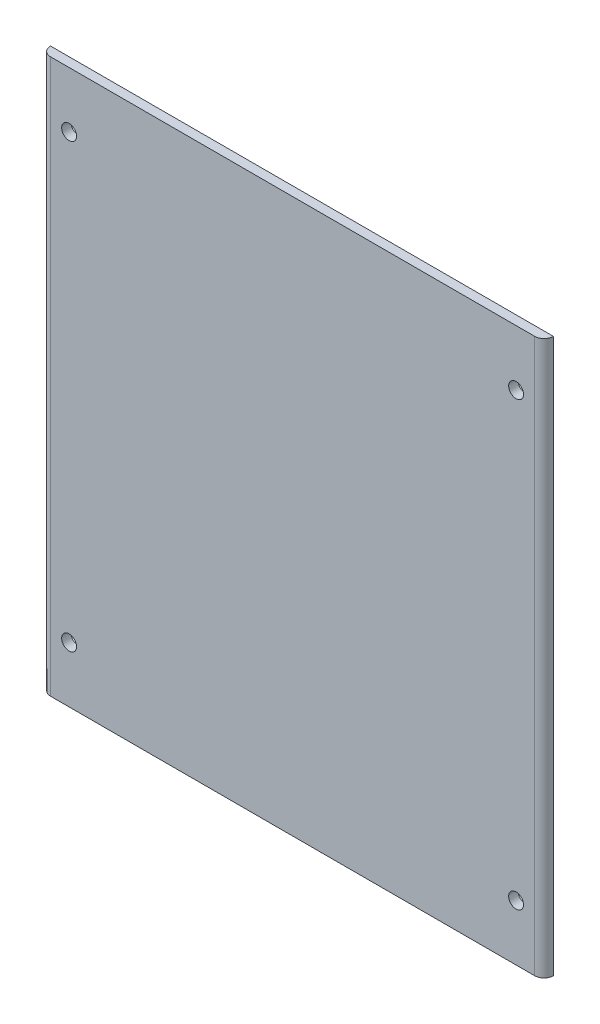
ISO-10303-21;
HEADER;
FILE_DESCRIPTION(('STEP AP214'),'2;1');
FILE_NAME('part.step','',(''),(''),'','','');
FILE_SCHEMA(('AUTOMOTIVE_DESIGN { 1 0 10303 214 1 1 1 1 }'));
ENDSEC;
DATA;
#1=APPLICATION_CONTEXT('core data for automotive mechanical design processes');
#2=APPLICATION_PROTOCOL_DEFINITION('international standard','automotive_design',2000,#1);
#3=PRODUCT_CONTEXT('',#1,'mechanical');
#4=PRODUCT('Part','Part','',(#3));
#5=PRODUCT_RELATED_PRODUCT_CATEGORY('part','',(#4));
#6=PRODUCT_DEFINITION_FORMATION('','',#4);
#7=PRODUCT_DEFINITION_CONTEXT('part definition',#1,'design');
#8=PRODUCT_DEFINITION('design','',#6,#7);
#9=PRODUCT_DEFINITION_SHAPE('','',#8);
#10=(LENGTH_UNIT() NAMED_UNIT(*) SI_UNIT(.MILLI.,.METRE.));
#11=(NAMED_UNIT(*) PLANE_ANGLE_UNIT() SI_UNIT($,.RADIAN.));
#12=(NAMED_UNIT(*) SI_UNIT($,.STERADIAN.) SOLID_ANGLE_UNIT());
#13=UNCERTAINTY_MEASURE_WITH_UNIT(LENGTH_MEASURE(1.E-05),#10,'distance_accuracy_value','');
#14=(GEOMETRIC_REPRESENTATION_CONTEXT(3) GLOBAL_UNCERTAINTY_ASSIGNED_CONTEXT((#13)) GLOBAL_UNIT_ASSIGNED_CONTEXT((#10,
#11,#12)) REPRESENTATION_CONTEXT('',''));
#15=CARTESIAN_POINT('',(0.,0.,0.));
#16=DIRECTION('',(0.,0.,1.));
#17=DIRECTION('',(1.,0.,0.));
#18=AXIS2_PLACEMENT_3D('',#15,#16,#17);
#19=CARTESIAN_POINT('',(-4.00000000000001,118.94,2.));
#20=DIRECTION('',(0.,-1.,0.));
#21=DIRECTION('',(1.,0.,0.));
#22=AXIS2_PLACEMENT_3D('',#19,#20,#21);
#23=PLANE('',#22);
#24=DIRECTION('',(-1.,0.,0.));
#25=VECTOR('',#24,1.);
#26=CARTESIAN_POINT('',(-4.00000000000001,118.94,2.));
#27=LINE('',#26,#25);
#28=CARTESIAN_POINT('',(-3.99999999999936,118.94,2.));
#29=VERTEX_POINT('',#28);
#30=CARTESIAN_POINT('',(-108.,118.94,2.));
#31=VERTEX_POINT('',#30);
#32=EDGE_CURVE('E130',#29,#31,#27,.T.);
#33=ORIENTED_EDGE('',*,*,#32,.F.);
#34=CARTESIAN_POINT('',(-3.99999999999936,118.94,0.));
#35=DIRECTION('',(0.,-1.,0.));
#36=DIRECTION('',(1.,0.,0.));
#37=AXIS2_PLACEMENT_3D('',#34,#35,#36);
#38=CIRCLE('',#37,2.);
#39=CARTESIAN_POINT('',(-1.99999999999936,118.940000000001,0.));
#40=VERTEX_POINT('',#39);
#41=EDGE_CURVE('E12',#29,#40,#38,.F.);
#42=ORIENTED_EDGE('',*,*,#41,.T.);
#43=DIRECTION('',(-1.,0.,0.));
#44=VECTOR('',#43,1.);
#45=CARTESIAN_POINT('',(-4.00000000000001,118.94,0.));
#46=LINE('',#45,#44);
#47=CARTESIAN_POINT('',(-110.,118.94,0.));
#48=VERTEX_POINT('',#47);
#49=EDGE_CURVE('E128',#40,#48,#46,.T.);
#50=ORIENTED_EDGE('',*,*,#49,.T.);
#51=CARTESIAN_POINT('',(-108.,118.94,0.));
#52=DIRECTION('',(0.,-1.,0.));
#53=DIRECTION('',(1.,0.,0.));
#54=AXIS2_PLACEMENT_3D('',#51,#52,#53);
#55=CIRCLE('',#54,2.);
#56=EDGE_CURVE('E97',#48,#31,#55,.F.);
#57=ORIENTED_EDGE('',*,*,#56,.T.);
#58=EDGE_LOOP('',(#33,#42,#50,#57));
#59=FACE_BOUND('',#58,.T.);
#60=ADVANCED_FACE('F89',(#59),#23,.F.);
#61=CARTESIAN_POINT('',(-4.00000000000001,0.,2.));
#62=DIRECTION('',(0.,1.,0.));
#63=DIRECTION('',(-1.,0.,0.));
#64=AXIS2_PLACEMENT_3D('',#61,#62,#63);
#65=PLANE('',#64);
#66=DIRECTION('',(1.,0.,0.));
#67=VECTOR('',#66,1.);
#68=CARTESIAN_POINT('',(-4.00000000000001,0.,0.));
#69=LINE('',#68,#67);
#70=CARTESIAN_POINT('',(-110.,0.,0.));
#71=VERTEX_POINT('',#70);
#72=CARTESIAN_POINT('',(-1.99999999999937,0.,0.));
#73=VERTEX_POINT('',#72);
#74=EDGE_CURVE('E140',#71,#73,#69,.T.);
#75=ORIENTED_EDGE('',*,*,#74,.T.);
#76=CARTESIAN_POINT('',(-3.99999999999937,0.,0.));
#77=DIRECTION('',(0.,1.,0.));
#78=DIRECTION('',(-1.,0.,0.));
#79=AXIS2_PLACEMENT_3D('',#76,#77,#78);
#80=CIRCLE('',#79,2.);
#81=CARTESIAN_POINT('',(-3.99999999999937,0.,2.));
#82=VERTEX_POINT('',#81);
#83=EDGE_CURVE('E143',#73,#82,#80,.F.);
#84=ORIENTED_EDGE('',*,*,#83,.T.);
#85=DIRECTION('',(1.,0.,0.));
#86=VECTOR('',#85,1.);
#87=CARTESIAN_POINT('',(-4.00000000000001,0.,2.));
#88=LINE('',#87,#86);
#89=CARTESIAN_POINT('',(-108.,0.,2.));
#90=VERTEX_POINT('',#89);
#91=EDGE_CURVE('E154',#90,#82,#88,.T.);
#92=ORIENTED_EDGE('',*,*,#91,.F.);
#93=CARTESIAN_POINT('',(-108.,0.,0.));
#94=DIRECTION('',(0.,1.,0.));
#95=DIRECTION('',(-1.,0.,0.));
#96=AXIS2_PLACEMENT_3D('',#93,#94,#95);
#97=CIRCLE('',#96,2.);
#98=EDGE_CURVE('E155',#90,#71,#97,.F.);
#99=ORIENTED_EDGE('',*,*,#98,.T.);
#100=EDGE_LOOP('',(#75,#84,#92,#99));
#101=FACE_BOUND('',#100,.T.);
#102=ADVANCED_FACE('F168',(#101),#65,.F.);
#103=CARTESIAN_POINT('',(0.,0.,2.));
#104=DIRECTION('',(0.,0.,1.));
#105=DIRECTION('',(1.,0.,0.));
#106=AXIS2_PLACEMENT_3D('',#103,#104,#105);
#107=PLANE('',#106);
#108=CARTESIAN_POINT('',(-104.,106.94,2.));
#109=DIRECTION('',(0.,0.,1.));
#110=DIRECTION('',(1.,0.,0.));
#111=AXIS2_PLACEMENT_3D('',#108,#109,#110);
#112=CIRCLE('',#111,1.60000000000001);
#113=CARTESIAN_POINT('',(-102.4,106.94,2.));
#114=VERTEX_POINT('',#113);
#115=EDGE_CURVE('E221',#114,#114,#112,.T.);
#116=ORIENTED_EDGE('',*,*,#115,.F.);
#117=EDGE_LOOP('',(#116));
#118=FACE_BOUND('',#117,.T.);
#119=CARTESIAN_POINT('',(-7.99999999999999,106.94,2.));
#120=DIRECTION('',(0.,0.,1.));
#121=DIRECTION('',(1.,0.,0.));
#122=AXIS2_PLACEMENT_3D('',#119,#120,#121);
#123=CIRCLE('',#122,1.6);
#124=CARTESIAN_POINT('',(-6.39999999999999,106.94,2.));
#125=VERTEX_POINT('',#124);
#126=EDGE_CURVE('E213',#125,#125,#123,.T.);
#127=ORIENTED_EDGE('',*,*,#126,.F.);
#128=EDGE_LOOP('',(#127));
#129=FACE_BOUND('',#128,.T.);
#130=CARTESIAN_POINT('',(-7.99999999999993,11.9999999999982,2.));
#131=DIRECTION('',(0.,0.,1.));
#132=DIRECTION('',(1.,0.,0.));
#133=AXIS2_PLACEMENT_3D('',#130,#131,#132);
#134=CIRCLE('',#133,1.60000000000045);
#135=CARTESIAN_POINT('',(-6.39999999999949,11.9999999999982,2.));
#136=VERTEX_POINT('',#135);
#137=EDGE_CURVE('E209',#136,#136,#134,.T.);
#138=ORIENTED_EDGE('',*,*,#137,.F.);
#139=EDGE_LOOP('',(#138));
#140=FACE_BOUND('',#139,.T.);
#141=CARTESIAN_POINT('',(-104.,11.9999999999964,2.));
#142=DIRECTION('',(0.,0.,1.));
#143=DIRECTION('',(1.,0.,0.));
#144=AXIS2_PLACEMENT_3D('',#141,#142,#143);
#145=CIRCLE('',#144,1.60000000000103);
#146=CARTESIAN_POINT('',(-102.399999999999,11.9999999999964,2.));
#147=VERTEX_POINT('',#146);
#148=EDGE_CURVE('E149',#147,#147,#145,.T.);
#149=ORIENTED_EDGE('',*,*,#148,.F.);
#150=EDGE_LOOP('',(#149));
#151=FACE_BOUND('',#150,.T.);
#152=ORIENTED_EDGE('',*,*,#91,.T.);
#153=DIRECTION('',(0.,-1.,0.));
#154=VECTOR('',#153,1.);
#155=CARTESIAN_POINT('',(-3.99999999999936,118.940000000001,2.));
#156=LINE('',#155,#154);
#157=EDGE_CURVE('E110',#82,#29,#156,.F.);
#158=ORIENTED_EDGE('',*,*,#157,.T.);
#159=ORIENTED_EDGE('',*,*,#32,.T.);
#160=DIRECTION('',(0.,1.,0.));
#161=VECTOR('',#160,1.);
#162=CARTESIAN_POINT('',(-108.,0.,2.));
#163=LINE('',#162,#161);
#164=EDGE_CURVE('E160',#31,#90,#163,.F.);
#165=ORIENTED_EDGE('',*,*,#164,.T.);
#166=EDGE_LOOP('',(#152,#158,#159,#165));
#167=FACE_BOUND('',#166,.T.);
#168=ADVANCED_FACE('F164',(#118,#129,#140,#151,#167),#107,.T.);
#169=CARTESIAN_POINT('',(0.,0.,0.));
#170=DIRECTION('',(0.,0.,1.));
#171=DIRECTION('',(1.,0.,0.));
#172=AXIS2_PLACEMENT_3D('',#169,#170,#171);
#173=PLANE('',#172);
#174=CARTESIAN_POINT('',(-104.,106.94,0.));
#175=DIRECTION('',(0.,0.,1.));
#176=DIRECTION('',(1.,0.,0.));
#177=AXIS2_PLACEMENT_3D('',#174,#175,#176);
#178=CIRCLE('',#177,1.60000000000001);
#179=CARTESIAN_POINT('',(-102.4,106.94,0.));
#180=VERTEX_POINT('',#179);
#181=EDGE_CURVE('E224',#180,#180,#178,.T.);
#182=ORIENTED_EDGE('',*,*,#181,.T.);
#183=EDGE_LOOP('',(#182));
#184=FACE_BOUND('',#183,.T.);
#185=CARTESIAN_POINT('',(-7.99999999999999,106.94,0.));
#186=DIRECTION('',(0.,0.,1.));
#187=DIRECTION('',(1.,0.,0.));
#188=AXIS2_PLACEMENT_3D('',#185,#186,#187);
#189=CIRCLE('',#188,1.6);
#190=CARTESIAN_POINT('',(-6.39999999999999,106.94,0.));
#191=VERTEX_POINT('',#190);
#192=EDGE_CURVE('E218',#191,#191,#189,.T.);
#193=ORIENTED_EDGE('',*,*,#192,.T.);
#194=EDGE_LOOP('',(#193));
#195=FACE_BOUND('',#194,.T.);
#196=CARTESIAN_POINT('',(-7.99999999999993,11.9999999999982,0.));
#197=DIRECTION('',(0.,0.,1.));
#198=DIRECTION('',(1.,0.,0.));
#199=AXIS2_PLACEMENT_3D('',#196,#197,#198);
#200=CIRCLE('',#199,1.60000000000045);
#201=CARTESIAN_POINT('',(-6.39999999999949,11.9999999999982,0.));
#202=VERTEX_POINT('',#201);
#203=EDGE_CURVE('E206',#202,#202,#200,.T.);
#204=ORIENTED_EDGE('',*,*,#203,.T.);
#205=EDGE_LOOP('',(#204));
#206=FACE_BOUND('',#205,.T.);
#207=CARTESIAN_POINT('',(-104.,11.9999999999964,0.));
#208=DIRECTION('',(0.,0.,1.));
#209=DIRECTION('',(1.,0.,0.));
#210=AXIS2_PLACEMENT_3D('',#207,#208,#209);
#211=CIRCLE('',#210,1.60000000000103);
#212=CARTESIAN_POINT('',(-102.399999999999,11.9999999999964,0.));
#213=VERTEX_POINT('',#212);
#214=EDGE_CURVE('E145',#213,#213,#211,.T.);
#215=ORIENTED_EDGE('',*,*,#214,.T.);
#216=EDGE_LOOP('',(#215));
#217=FACE_BOUND('',#216,.T.);
#218=ORIENTED_EDGE('',*,*,#49,.F.);
#219=DIRECTION('',(0.,-1.,0.));
#220=VECTOR('',#219,1.);
#221=CARTESIAN_POINT('',(-1.99999999999936,118.940000000001,0.));
#222=LINE('',#221,#220);
#223=EDGE_CURVE('E137',#40,#73,#222,.T.);
#224=ORIENTED_EDGE('',*,*,#223,.T.);
#225=ORIENTED_EDGE('',*,*,#74,.F.);
#226=DIRECTION('',(0.,1.,0.));
#227=VECTOR('',#226,1.);
#228=CARTESIAN_POINT('',(-110.,0.,0.));
#229=LINE('',#228,#227);
#230=EDGE_CURVE('E139',#71,#48,#229,.T.);
#231=ORIENTED_EDGE('',*,*,#230,.T.);
#232=EDGE_LOOP('',(#218,#224,#225,#231));
#233=FACE_BOUND('',#232,.T.);
#234=ADVANCED_FACE('F135',(#184,#195,#206,#217,#233),#173,.F.);
#235=CARTESIAN_POINT('',(-104.,11.9999999999964,0.));
#236=DIRECTION('',(0.,0.,1.));
#237=DIRECTION('',(1.,0.,0.));
#238=AXIS2_PLACEMENT_3D('',#235,#236,#237);
#239=CYLINDRICAL_SURFACE('',#238,1.60000000000103);
#240=ORIENTED_EDGE('',*,*,#214,.F.);
#241=EDGE_LOOP('',(#240));
#242=FACE_BOUND('',#241,.T.);
#243=ORIENTED_EDGE('',*,*,#148,.T.);
#244=EDGE_LOOP('',(#243));
#245=FACE_BOUND('',#244,.T.);
#246=ADVANCED_FACE('F184',(#242,#245),#239,.F.);
#247=CARTESIAN_POINT('',(-7.99999999999993,11.9999999999982,0.));
#248=DIRECTION('',(0.,0.,1.));
#249=DIRECTION('',(1.,0.,0.));
#250=AXIS2_PLACEMENT_3D('',#247,#248,#249);
#251=CYLINDRICAL_SURFACE('',#250,1.60000000000045);
#252=ORIENTED_EDGE('',*,*,#203,.F.);
#253=EDGE_LOOP('',(#252));
#254=FACE_BOUND('',#253,.T.);
#255=ORIENTED_EDGE('',*,*,#137,.T.);
#256=EDGE_LOOP('',(#255));
#257=FACE_BOUND('',#256,.T.);
#258=ADVANCED_FACE('F191',(#254,#257),#251,.F.);
#259=CARTESIAN_POINT('',(-7.99999999999999,106.94,0.));
#260=DIRECTION('',(0.,0.,1.));
#261=DIRECTION('',(1.,0.,0.));
#262=AXIS2_PLACEMENT_3D('',#259,#260,#261);
#263=CYLINDRICAL_SURFACE('',#262,1.6);
#264=ORIENTED_EDGE('',*,*,#192,.F.);
#265=EDGE_LOOP('',(#264));
#266=FACE_BOUND('',#265,.T.);
#267=ORIENTED_EDGE('',*,*,#126,.T.);
#268=EDGE_LOOP('',(#267));
#269=FACE_BOUND('',#268,.T.);
#270=ADVANCED_FACE('F194',(#266,#269),#263,.F.);
#271=CARTESIAN_POINT('',(-104.,106.94,0.));
#272=DIRECTION('',(0.,0.,1.));
#273=DIRECTION('',(1.,0.,0.));
#274=AXIS2_PLACEMENT_3D('',#271,#272,#273);
#275=CYLINDRICAL_SURFACE('',#274,1.60000000000001);
#276=ORIENTED_EDGE('',*,*,#181,.F.);
#277=EDGE_LOOP('',(#276));
#278=FACE_BOUND('',#277,.T.);
#279=ORIENTED_EDGE('',*,*,#115,.T.);
#280=EDGE_LOOP('',(#279));
#281=FACE_BOUND('',#280,.T.);
#282=ADVANCED_FACE('F173',(#278,#281),#275,.F.);
#283=CARTESIAN_POINT('',(-3.99999999999937,0.,0.));
#284=DIRECTION('',(0.,1.,0.));
#285=DIRECTION('',(-1.,0.,0.));
#286=AXIS2_PLACEMENT_3D('',#283,#284,#285);
#287=CYLINDRICAL_SURFACE('',#286,2.);
#288=ORIENTED_EDGE('',*,*,#41,.F.);
#289=ORIENTED_EDGE('',*,*,#157,.F.);
#290=ORIENTED_EDGE('',*,*,#83,.F.);
#291=ORIENTED_EDGE('',*,*,#223,.F.);
#292=EDGE_LOOP('',(#288,#289,#290,#291));
#293=FACE_BOUND('',#292,.T.);
#294=ADVANCED_FACE('F142',(#293),#287,.T.);
#295=CARTESIAN_POINT('',(-108.,0.,0.));
#296=DIRECTION('',(0.,1.,0.));
#297=DIRECTION('',(-1.,0.,0.));
#298=AXIS2_PLACEMENT_3D('',#295,#296,#297);
#299=CYLINDRICAL_SURFACE('',#298,2.);
#300=ORIENTED_EDGE('',*,*,#98,.F.);
#301=ORIENTED_EDGE('',*,*,#164,.F.);
#302=ORIENTED_EDGE('',*,*,#56,.F.);
#303=ORIENTED_EDGE('',*,*,#230,.F.);
#304=EDGE_LOOP('',(#300,#301,#302,#303));
#305=FACE_BOUND('',#304,.T.);
#306=ADVANCED_FACE('F91',(#305),#299,.T.);
#307=CLOSED_SHELL('',(#60,#102,#168,#234,#246,#258,#270,#282,#294,#306));
#308=MANIFOLD_SOLID_BREP('B2',#307);
#309=ADVANCED_BREP_SHAPE_REPRESENTATION('',(#18,#308),#14);
#310=SHAPE_DEFINITION_REPRESENTATION(#9,#309);
ENDSEC;
END-ISO-10303-21;
